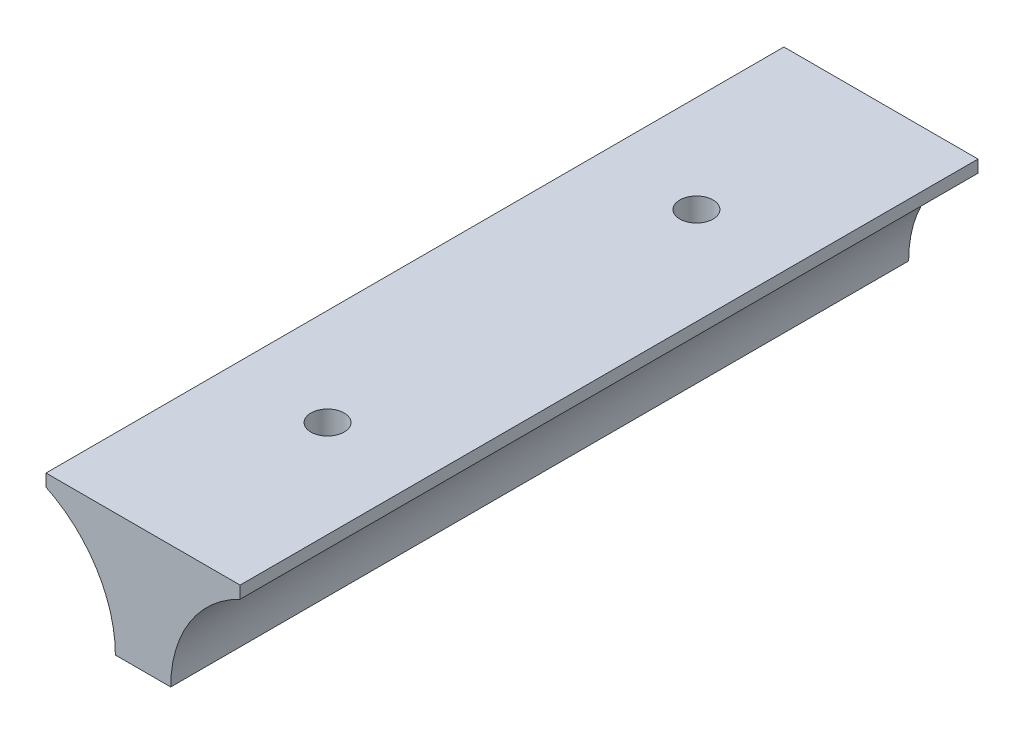
ISO-10303-21;
HEADER;
FILE_DESCRIPTION(('STEP AP214'),'2;1');
FILE_NAME('part.step','',(''),(''),'','','');
FILE_SCHEMA(('AUTOMOTIVE_DESIGN { 1 0 10303 214 1 1 1 1 }'));
ENDSEC;
DATA;
#1=APPLICATION_CONTEXT('core data for automotive mechanical design processes');
#2=APPLICATION_PROTOCOL_DEFINITION('international standard','automotive_design',2000,#1);
#3=PRODUCT_CONTEXT('',#1,'mechanical');
#4=PRODUCT('Part','Part','',(#3));
#5=PRODUCT_RELATED_PRODUCT_CATEGORY('part','',(#4));
#6=PRODUCT_DEFINITION_FORMATION('','',#4);
#7=PRODUCT_DEFINITION_CONTEXT('part definition',#1,'design');
#8=PRODUCT_DEFINITION('design','',#6,#7);
#9=PRODUCT_DEFINITION_SHAPE('','',#8);
#10=(LENGTH_UNIT() NAMED_UNIT(*) SI_UNIT(.MILLI.,.METRE.));
#11=(NAMED_UNIT(*) PLANE_ANGLE_UNIT() SI_UNIT($,.RADIAN.));
#12=(NAMED_UNIT(*) SI_UNIT($,.STERADIAN.) SOLID_ANGLE_UNIT());
#13=UNCERTAINTY_MEASURE_WITH_UNIT(LENGTH_MEASURE(1.E-05),#10,'distance_accuracy_value','');
#14=(GEOMETRIC_REPRESENTATION_CONTEXT(3) GLOBAL_UNCERTAINTY_ASSIGNED_CONTEXT((#13)) GLOBAL_UNIT_ASSIGNED_CONTEXT((#10,
#11,#12)) REPRESENTATION_CONTEXT('',''));
#15=CARTESIAN_POINT('',(0.,0.,0.));
#16=DIRECTION('',(0.,0.,1.));
#17=DIRECTION('',(1.,0.,0.));
#18=AXIS2_PLACEMENT_3D('',#15,#16,#17);
#19=CARTESIAN_POINT('',(7.89110105645933,10.,60.));
#20=DIRECTION('',(0.,-1.,0.));
#21=DIRECTION('',(0.,0.,-1.));
#22=AXIS2_PLACEMENT_3D('',#19,#20,#21);
#23=PLANE('',#22);
#24=CARTESIAN_POINT('',(0.,10.,45.));
#25=DIRECTION('',(0.,1.,0.));
#26=DIRECTION('',(0.,0.,1.));
#27=AXIS2_PLACEMENT_3D('',#24,#25,#26);
#28=CIRCLE('',#27,1.35);
#29=CARTESIAN_POINT('',(0.,10.,46.35));
#30=VERTEX_POINT('',#29);
#31=EDGE_CURVE('E208',#30,#30,#28,.T.);
#32=ORIENTED_EDGE('',*,*,#31,.F.);
#33=EDGE_LOOP('',(#32));
#34=FACE_BOUND('',#33,.T.);
#35=DIRECTION('',(-1.,0.,0.));
#36=VECTOR('',#35,1.);
#37=CARTESIAN_POINT('',(7.89110105645933,10.,0.));
#38=LINE('',#37,#36);
#39=CARTESIAN_POINT('',(7.89110105645933,10.,0.));
#40=VERTEX_POINT('',#39);
#41=CARTESIAN_POINT('',(-7.89110105645933,10.,0.));
#42=VERTEX_POINT('',#41);
#43=EDGE_CURVE('E80',#40,#42,#38,.T.);
#44=ORIENTED_EDGE('',*,*,#43,.T.);
#45=DIRECTION('',(0.,0.,-1.));
#46=VECTOR('',#45,1.);
#47=CARTESIAN_POINT('',(-7.89110105645933,10.,60.));
#48=LINE('',#47,#46);
#49=CARTESIAN_POINT('',(-7.89110105645933,10.,60.));
#50=VERTEX_POINT('',#49);
#51=EDGE_CURVE('E119',#50,#42,#48,.T.);
#52=ORIENTED_EDGE('',*,*,#51,.F.);
#53=DIRECTION('',(-1.,0.,0.));
#54=VECTOR('',#53,1.);
#55=CARTESIAN_POINT('',(7.89110105645933,10.,60.));
#56=LINE('',#55,#54);
#57=CARTESIAN_POINT('',(7.89110105645933,10.,60.));
#58=VERTEX_POINT('',#57);
#59=EDGE_CURVE('E105',#58,#50,#56,.T.);
#60=ORIENTED_EDGE('',*,*,#59,.F.);
#61=DIRECTION('',(0.,0.,-1.));
#62=VECTOR('',#61,1.);
#63=CARTESIAN_POINT('',(7.89110105645933,10.,60.));
#64=LINE('',#63,#62);
#65=EDGE_CURVE('E113',#58,#40,#64,.T.);
#66=ORIENTED_EDGE('',*,*,#65,.T.);
#67=EDGE_LOOP('',(#44,#52,#60,#66));
#68=FACE_BOUND('',#67,.T.);
#69=CARTESIAN_POINT('',(0.,10.,15.));
#70=DIRECTION('',(0.,1.,0.));
#71=DIRECTION('',(0.,0.,1.));
#72=AXIS2_PLACEMENT_3D('',#69,#70,#71);
#73=CIRCLE('',#72,1.35);
#74=CARTESIAN_POINT('',(0.,10.,16.35));
#75=VERTEX_POINT('',#74);
#76=EDGE_CURVE('E195',#75,#75,#73,.T.);
#77=ORIENTED_EDGE('',*,*,#76,.F.);
#78=EDGE_LOOP('',(#77));
#79=FACE_BOUND('',#78,.T.);
#80=ADVANCED_FACE('F39',(#34,#68,#79),#23,.F.);
#81=CARTESIAN_POINT('',(-12.25,0.,60.));
#82=DIRECTION('',(0.,0.,-1.));
#83=DIRECTION('',(-1.,0.,0.));
#84=AXIS2_PLACEMENT_3D('',#81,#82,#83);
#85=CYLINDRICAL_SURFACE('',#84,10.);
#86=CARTESIAN_POINT('',(-12.25,0.,0.));
#87=DIRECTION('',(0.,0.,-1.));
#88=DIRECTION('',(1.,0.,0.));
#89=AXIS2_PLACEMENT_3D('',#86,#87,#88);
#90=CIRCLE('',#89,10.);
#91=CARTESIAN_POINT('',(-7.89110105645933,9.,0.));
#92=VERTEX_POINT('',#91);
#93=CARTESIAN_POINT('',(-2.25,0.,0.));
#94=VERTEX_POINT('',#93);
#95=EDGE_CURVE('E129',#92,#94,#90,.T.);
#96=ORIENTED_EDGE('',*,*,#95,.T.);
#97=DIRECTION('',(0.,0.,-1.));
#98=VECTOR('',#97,1.);
#99=CARTESIAN_POINT('',(-2.25,0.,60.));
#100=LINE('',#99,#98);
#101=CARTESIAN_POINT('',(-2.25,0.,60.));
#102=VERTEX_POINT('',#101);
#103=EDGE_CURVE('E11',#102,#94,#100,.T.);
#104=ORIENTED_EDGE('',*,*,#103,.F.);
#105=CARTESIAN_POINT('',(-12.25,0.,60.));
#106=DIRECTION('',(0.,0.,-1.));
#107=DIRECTION('',(1.,0.,0.));
#108=AXIS2_PLACEMENT_3D('',#105,#106,#107);
#109=CIRCLE('',#108,10.);
#110=CARTESIAN_POINT('',(-7.89110105645933,9.,60.));
#111=VERTEX_POINT('',#110);
#112=EDGE_CURVE('E146',#111,#102,#109,.T.);
#113=ORIENTED_EDGE('',*,*,#112,.F.);
#114=DIRECTION('',(0.,0.,-1.));
#115=VECTOR('',#114,1.);
#116=CARTESIAN_POINT('',(-7.89110105645933,9.,60.));
#117=LINE('',#116,#115);
#118=EDGE_CURVE('E125',#111,#92,#117,.T.);
#119=ORIENTED_EDGE('',*,*,#118,.T.);
#120=EDGE_LOOP('',(#96,#104,#113,#119));
#121=FACE_BOUND('',#120,.T.);
#122=ADVANCED_FACE('F41',(#121),#85,.F.);
#123=CARTESIAN_POINT('',(-2.25,0.,60.));
#124=DIRECTION('',(0.,1.,0.));
#125=DIRECTION('',(-1.,0.,0.));
#126=AXIS2_PLACEMENT_3D('',#123,#124,#125);
#127=PLANE('',#126);
#128=CARTESIAN_POINT('',(0.,0.,45.));
#129=DIRECTION('',(0.,1.,0.));
#130=DIRECTION('',(-1.,0.,0.));
#131=AXIS2_PLACEMENT_3D('',#128,#129,#130);
#132=CIRCLE('',#131,1.35);
#133=CARTESIAN_POINT('',(-1.35,0.,45.));
#134=VERTEX_POINT('',#133);
#135=EDGE_CURVE('E190',#134,#134,#132,.T.);
#136=ORIENTED_EDGE('',*,*,#135,.T.);
#137=EDGE_LOOP('',(#136));
#138=FACE_BOUND('',#137,.T.);
#139=CARTESIAN_POINT('',(0.,0.,15.));
#140=DIRECTION('',(0.,1.,0.));
#141=DIRECTION('',(-1.,0.,0.));
#142=AXIS2_PLACEMENT_3D('',#139,#140,#141);
#143=CIRCLE('',#142,1.35);
#144=CARTESIAN_POINT('',(-1.35,0.,15.));
#145=VERTEX_POINT('',#144);
#146=EDGE_CURVE('E134',#145,#145,#143,.T.);
#147=ORIENTED_EDGE('',*,*,#146,.T.);
#148=EDGE_LOOP('',(#147));
#149=FACE_BOUND('',#148,.T.);
#150=DIRECTION('',(1.,0.,0.));
#151=VECTOR('',#150,1.);
#152=CARTESIAN_POINT('',(-2.25,0.,0.));
#153=LINE('',#152,#151);
#154=CARTESIAN_POINT('',(2.25,0.,0.));
#155=VERTEX_POINT('',#154);
#156=EDGE_CURVE('E133',#94,#155,#153,.T.);
#157=ORIENTED_EDGE('',*,*,#156,.T.);
#158=DIRECTION('',(0.,0.,-1.));
#159=VECTOR('',#158,1.);
#160=CARTESIAN_POINT('',(2.25,0.,60.));
#161=LINE('',#160,#159);
#162=CARTESIAN_POINT('',(2.25,0.,60.));
#163=VERTEX_POINT('',#162);
#164=EDGE_CURVE('E49',#163,#155,#161,.T.);
#165=ORIENTED_EDGE('',*,*,#164,.F.);
#166=DIRECTION('',(1.,0.,0.));
#167=VECTOR('',#166,1.);
#168=CARTESIAN_POINT('',(-2.25,0.,60.));
#169=LINE('',#168,#167);
#170=EDGE_CURVE('E94',#102,#163,#169,.T.);
#171=ORIENTED_EDGE('',*,*,#170,.F.);
#172=ORIENTED_EDGE('',*,*,#103,.T.);
#173=EDGE_LOOP('',(#157,#165,#171,#172));
#174=FACE_BOUND('',#173,.T.);
#175=ADVANCED_FACE('F179',(#138,#149,#174),#127,.F.);
#176=CARTESIAN_POINT('',(12.25,0.,60.));
#177=DIRECTION('',(0.,0.,-1.));
#178=DIRECTION('',(-1.,0.,0.));
#179=AXIS2_PLACEMENT_3D('',#176,#177,#178);
#180=CYLINDRICAL_SURFACE('',#179,10.);
#181=CARTESIAN_POINT('',(12.25,0.,0.));
#182=DIRECTION('',(0.,0.,-1.));
#183=DIRECTION('',(-1.,0.,0.));
#184=AXIS2_PLACEMENT_3D('',#181,#182,#183);
#185=CIRCLE('',#184,10.);
#186=CARTESIAN_POINT('',(7.89110105645933,9.,0.));
#187=VERTEX_POINT('',#186);
#188=EDGE_CURVE('E137',#155,#187,#185,.T.);
#189=ORIENTED_EDGE('',*,*,#188,.T.);
#190=DIRECTION('',(0.,0.,-1.));
#191=VECTOR('',#190,1.);
#192=CARTESIAN_POINT('',(7.89110105645933,9.,60.));
#193=LINE('',#192,#191);
#194=CARTESIAN_POINT('',(7.89110105645933,9.,60.));
#195=VERTEX_POINT('',#194);
#196=EDGE_CURVE('E118',#195,#187,#193,.T.);
#197=ORIENTED_EDGE('',*,*,#196,.F.);
#198=CARTESIAN_POINT('',(12.25,0.,60.));
#199=DIRECTION('',(0.,0.,-1.));
#200=DIRECTION('',(-1.,0.,0.));
#201=AXIS2_PLACEMENT_3D('',#198,#199,#200);
#202=CIRCLE('',#201,10.);
#203=EDGE_CURVE('E107',#163,#195,#202,.T.);
#204=ORIENTED_EDGE('',*,*,#203,.F.);
#205=ORIENTED_EDGE('',*,*,#164,.T.);
#206=EDGE_LOOP('',(#189,#197,#204,#205));
#207=FACE_BOUND('',#206,.T.);
#208=ADVANCED_FACE('F156',(#207),#180,.F.);
#209=CARTESIAN_POINT('',(7.89110105645933,9.,60.));
#210=DIRECTION('',(-1.,0.,0.));
#211=DIRECTION('',(0.,0.,1.));
#212=AXIS2_PLACEMENT_3D('',#209,#210,#211);
#213=PLANE('',#212);
#214=DIRECTION('',(0.,1.,0.));
#215=VECTOR('',#214,1.);
#216=CARTESIAN_POINT('',(7.89110105645933,9.,0.));
#217=LINE('',#216,#215);
#218=EDGE_CURVE('E116',#187,#40,#217,.T.);
#219=ORIENTED_EDGE('',*,*,#218,.T.);
#220=ORIENTED_EDGE('',*,*,#65,.F.);
#221=DIRECTION('',(0.,1.,0.));
#222=VECTOR('',#221,1.);
#223=CARTESIAN_POINT('',(7.89110105645933,9.,60.));
#224=LINE('',#223,#222);
#225=EDGE_CURVE('E101',#195,#58,#224,.T.);
#226=ORIENTED_EDGE('',*,*,#225,.F.);
#227=ORIENTED_EDGE('',*,*,#196,.T.);
#228=EDGE_LOOP('',(#219,#220,#226,#227));
#229=FACE_BOUND('',#228,.T.);
#230=ADVANCED_FACE('F114',(#229),#213,.F.);
#231=CARTESIAN_POINT('',(-7.89110105645933,10.,60.));
#232=DIRECTION('',(1.,0.,0.));
#233=DIRECTION('',(0.,0.,-1.));
#234=AXIS2_PLACEMENT_3D('',#231,#232,#233);
#235=PLANE('',#234);
#236=DIRECTION('',(0.,-1.,0.));
#237=VECTOR('',#236,1.);
#238=CARTESIAN_POINT('',(-7.89110105645933,10.,0.));
#239=LINE('',#238,#237);
#240=EDGE_CURVE('E86',#42,#92,#239,.T.);
#241=ORIENTED_EDGE('',*,*,#240,.T.);
#242=ORIENTED_EDGE('',*,*,#118,.F.);
#243=DIRECTION('',(0.,-1.,0.));
#244=VECTOR('',#243,1.);
#245=CARTESIAN_POINT('',(-7.89110105645933,10.,60.));
#246=LINE('',#245,#244);
#247=EDGE_CURVE('E57',#50,#111,#246,.T.);
#248=ORIENTED_EDGE('',*,*,#247,.F.);
#249=ORIENTED_EDGE('',*,*,#51,.T.);
#250=EDGE_LOOP('',(#241,#242,#248,#249));
#251=FACE_BOUND('',#250,.T.);
#252=ADVANCED_FACE('F163',(#251),#235,.F.);
#253=CARTESIAN_POINT('',(-12.25,0.,60.));
#254=DIRECTION('',(0.,0.,1.));
#255=DIRECTION('',(1.,0.,0.));
#256=AXIS2_PLACEMENT_3D('',#253,#254,#255);
#257=PLANE('',#256);
#258=ORIENTED_EDGE('',*,*,#112,.T.);
#259=ORIENTED_EDGE('',*,*,#170,.T.);
#260=ORIENTED_EDGE('',*,*,#203,.T.);
#261=ORIENTED_EDGE('',*,*,#225,.T.);
#262=ORIENTED_EDGE('',*,*,#59,.T.);
#263=ORIENTED_EDGE('',*,*,#247,.T.);
#264=EDGE_LOOP('',(#258,#259,#260,#261,#262,#263));
#265=FACE_BOUND('',#264,.T.);
#266=ADVANCED_FACE('F103',(#265),#257,.T.);
#267=CARTESIAN_POINT('',(-12.25,0.,0.));
#268=DIRECTION('',(0.,0.,1.));
#269=DIRECTION('',(1.,0.,0.));
#270=AXIS2_PLACEMENT_3D('',#267,#268,#269);
#271=PLANE('',#270);
#272=ORIENTED_EDGE('',*,*,#95,.F.);
#273=ORIENTED_EDGE('',*,*,#240,.F.);
#274=ORIENTED_EDGE('',*,*,#43,.F.);
#275=ORIENTED_EDGE('',*,*,#218,.F.);
#276=ORIENTED_EDGE('',*,*,#188,.F.);
#277=ORIENTED_EDGE('',*,*,#156,.F.);
#278=EDGE_LOOP('',(#272,#273,#274,#275,#276,#277));
#279=FACE_BOUND('',#278,.T.);
#280=ADVANCED_FACE('F159',(#279),#271,.F.);
#281=CARTESIAN_POINT('',(0.,10.,15.));
#282=DIRECTION('',(0.,1.,0.));
#283=DIRECTION('',(0.,0.,1.));
#284=AXIS2_PLACEMENT_3D('',#281,#282,#283);
#285=CYLINDRICAL_SURFACE('',#284,1.35);
#286=ORIENTED_EDGE('',*,*,#146,.F.);
#287=EDGE_LOOP('',(#286));
#288=FACE_BOUND('',#287,.T.);
#289=ORIENTED_EDGE('',*,*,#76,.T.);
#290=EDGE_LOOP('',(#289));
#291=FACE_BOUND('',#290,.T.);
#292=ADVANCED_FACE('F214',(#288,#291),#285,.F.);
#293=CARTESIAN_POINT('',(0.,10.,45.));
#294=DIRECTION('',(0.,1.,0.));
#295=DIRECTION('',(0.,0.,1.));
#296=AXIS2_PLACEMENT_3D('',#293,#294,#295);
#297=CYLINDRICAL_SURFACE('',#296,1.35);
#298=ORIENTED_EDGE('',*,*,#135,.F.);
#299=EDGE_LOOP('',(#298));
#300=FACE_BOUND('',#299,.T.);
#301=ORIENTED_EDGE('',*,*,#31,.T.);
#302=EDGE_LOOP('',(#301));
#303=FACE_BOUND('',#302,.T.);
#304=ADVANCED_FACE('F212',(#300,#303),#297,.F.);
#305=CLOSED_SHELL('',(#80,#122,#175,#208,#230,#252,#266,#280,#292,#304));
#306=MANIFOLD_SOLID_BREP('B2',#305);
#307=ADVANCED_BREP_SHAPE_REPRESENTATION('',(#18,#306),#14);
#308=SHAPE_DEFINITION_REPRESENTATION(#9,#307);
ENDSEC;
END-ISO-10303-21;
